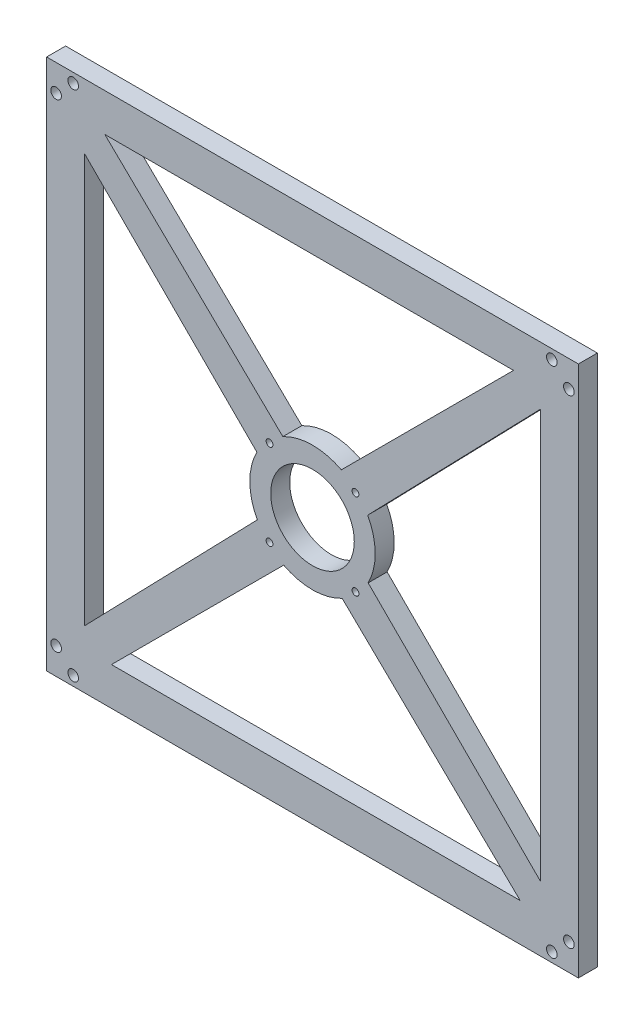
ISO-10303-21;
HEADER;
FILE_DESCRIPTION(('STEP AP214'),'2;1');
FILE_NAME('part.step','',(''),(''),'','','');
FILE_SCHEMA(('AUTOMOTIVE_DESIGN { 1 0 10303 214 1 1 1 1 }'));
ENDSEC;
DATA;
#1=APPLICATION_CONTEXT('core data for automotive mechanical design processes');
#2=APPLICATION_PROTOCOL_DEFINITION('international standard','automotive_design',2000,#1);
#3=PRODUCT_CONTEXT('',#1,'mechanical');
#4=PRODUCT('Part','Part','',(#3));
#5=PRODUCT_RELATED_PRODUCT_CATEGORY('part','',(#4));
#6=PRODUCT_DEFINITION_FORMATION('','',#4);
#7=PRODUCT_DEFINITION_CONTEXT('part definition',#1,'design');
#8=PRODUCT_DEFINITION('design','',#6,#7);
#9=PRODUCT_DEFINITION_SHAPE('','',#8);
#10=(LENGTH_UNIT() NAMED_UNIT(*) SI_UNIT(.MILLI.,.METRE.));
#11=(NAMED_UNIT(*) PLANE_ANGLE_UNIT() SI_UNIT($,.RADIAN.));
#12=(NAMED_UNIT(*) SI_UNIT($,.STERADIAN.) SOLID_ANGLE_UNIT());
#13=UNCERTAINTY_MEASURE_WITH_UNIT(LENGTH_MEASURE(1.E-05),#10,'distance_accuracy_value','');
#14=(GEOMETRIC_REPRESENTATION_CONTEXT(3) GLOBAL_UNCERTAINTY_ASSIGNED_CONTEXT((#13)) GLOBAL_UNIT_ASSIGNED_CONTEXT((#10,
#11,#12)) REPRESENTATION_CONTEXT('',''));
#15=CARTESIAN_POINT('',(0.,0.,0.));
#16=DIRECTION('',(0.,0.,1.));
#17=DIRECTION('',(1.,0.,0.));
#18=AXIS2_PLACEMENT_3D('',#15,#16,#17);
#19=CARTESIAN_POINT('',(0.,0.,0.));
#20=DIRECTION('',(0.,0.,1.));
#21=DIRECTION('',(1.,0.,0.));
#22=AXIS2_PLACEMENT_3D('',#19,#20,#21);
#23=PLANE('',#22);
#24=CARTESIAN_POINT('',(67.5000000000007,62.9999999999993,0.));
#25=DIRECTION('',(0.,0.,1.));
#26=DIRECTION('',(1.,0.,0.));
#27=AXIS2_PLACEMENT_3D('',#24,#25,#26);
#28=CIRCLE('',#27,1.39999999999998);
#29=CARTESIAN_POINT('',(68.9000000000007,62.9999999999993,0.));
#30=VERTEX_POINT('',#29);
#31=EDGE_CURVE('E552',#30,#30,#28,.T.);
#32=ORIENTED_EDGE('',*,*,#31,.T.);
#33=EDGE_LOOP('',(#32));
#34=FACE_BOUND('',#33,.T.);
#35=CARTESIAN_POINT('',(-63.,67.5,0.));
#36=DIRECTION('',(0.,0.,1.));
#37=DIRECTION('',(1.,0.,0.));
#38=AXIS2_PLACEMENT_3D('',#35,#36,#37);
#39=CIRCLE('',#38,1.39999999999999);
#40=CARTESIAN_POINT('',(-61.6,67.5,0.));
#41=VERTEX_POINT('',#40);
#42=EDGE_CURVE('E544',#41,#41,#39,.T.);
#43=ORIENTED_EDGE('',*,*,#42,.T.);
#44=EDGE_LOOP('',(#43));
#45=FACE_BOUND('',#44,.T.);
#46=CARTESIAN_POINT('',(-67.5000000000002,-62.9999999999998,0.));
#47=DIRECTION('',(0.,0.,1.));
#48=DIRECTION('',(1.,0.,0.));
#49=AXIS2_PLACEMENT_3D('',#46,#47,#48);
#50=CIRCLE('',#49,1.39999999999998);
#51=CARTESIAN_POINT('',(-66.1000000000002,-62.9999999999998,0.));
#52=VERTEX_POINT('',#51);
#53=EDGE_CURVE('E536',#52,#52,#50,.T.);
#54=ORIENTED_EDGE('',*,*,#53,.T.);
#55=EDGE_LOOP('',(#54));
#56=FACE_BOUND('',#55,.T.);
#57=CARTESIAN_POINT('',(63.0000000000007,67.4999999999993,0.));
#58=DIRECTION('',(0.,0.,-1.));
#59=DIRECTION('',(-1.,0.,0.));
#60=AXIS2_PLACEMENT_3D('',#57,#58,#59);
#61=CIRCLE('',#60,1.39999999999998);
#62=CARTESIAN_POINT('',(61.6000000000007,67.4999999999993,0.));
#63=VERTEX_POINT('',#62);
#64=EDGE_CURVE('E532',#63,#63,#61,.T.);
#65=ORIENTED_EDGE('',*,*,#64,.F.);
#66=EDGE_LOOP('',(#65));
#67=FACE_BOUND('',#66,.T.);
#68=CARTESIAN_POINT('',(-67.5,63.,0.));
#69=DIRECTION('',(0.,0.,-1.));
#70=DIRECTION('',(-1.,0.,0.));
#71=AXIS2_PLACEMENT_3D('',#68,#69,#70);
#72=CIRCLE('',#71,1.39999999999998);
#73=CARTESIAN_POINT('',(-68.9,63.,0.));
#74=VERTEX_POINT('',#73);
#75=EDGE_CURVE('E522',#74,#74,#72,.T.);
#76=ORIENTED_EDGE('',*,*,#75,.F.);
#77=EDGE_LOOP('',(#76));
#78=FACE_BOUND('',#77,.T.);
#79=CARTESIAN_POINT('',(63.,-67.5,0.));
#80=DIRECTION('',(0.,0.,1.));
#81=DIRECTION('',(1.,0.,0.));
#82=AXIS2_PLACEMENT_3D('',#79,#80,#81);
#83=CIRCLE('',#82,1.39999999999998);
#84=CARTESIAN_POINT('',(64.4,-67.5,0.));
#85=VERTEX_POINT('',#84);
#86=EDGE_CURVE('E42',#85,#85,#83,.T.);
#87=ORIENTED_EDGE('',*,*,#86,.T.);
#88=EDGE_LOOP('',(#87));
#89=FACE_BOUND('',#88,.T.);
#90=CARTESIAN_POINT('',(67.5,-63.,0.));
#91=DIRECTION('',(0.,0.,-1.));
#92=DIRECTION('',(-1.,0.,0.));
#93=AXIS2_PLACEMENT_3D('',#90,#91,#92);
#94=CIRCLE('',#93,1.39999999999998);
#95=CARTESIAN_POINT('',(66.1,-63.,0.));
#96=VERTEX_POINT('',#95);
#97=EDGE_CURVE('E407',#96,#96,#94,.T.);
#98=ORIENTED_EDGE('',*,*,#97,.F.);
#99=EDGE_LOOP('',(#98));
#100=FACE_BOUND('',#99,.T.);
#101=CARTESIAN_POINT('',(-11.3137084989846,-11.3137084989849,0.));
#102=DIRECTION('',(0.,0.,1.));
#103=DIRECTION('',(1.,0.,0.));
#104=AXIS2_PLACEMENT_3D('',#101,#102,#103);
#105=CIRCLE('',#104,0.899999999999999);
#106=CARTESIAN_POINT('',(-10.4137084989846,-11.3137084989849,0.));
#107=VERTEX_POINT('',#106);
#108=EDGE_CURVE('E413',#107,#107,#105,.T.);
#109=ORIENTED_EDGE('',*,*,#108,.T.);
#110=EDGE_LOOP('',(#109));
#111=FACE_BOUND('',#110,.T.);
#112=CARTESIAN_POINT('',(-11.3137084989848,11.3137084989848,0.));
#113=DIRECTION('',(0.,0.,1.));
#114=DIRECTION('',(1.,0.,0.));
#115=AXIS2_PLACEMENT_3D('',#112,#113,#114);
#116=CIRCLE('',#115,0.899999999999999);
#117=CARTESIAN_POINT('',(-10.4137084989848,11.3137084989848,0.));
#118=VERTEX_POINT('',#117);
#119=EDGE_CURVE('E432',#118,#118,#116,.T.);
#120=ORIENTED_EDGE('',*,*,#119,.T.);
#121=EDGE_LOOP('',(#120));
#122=FACE_BOUND('',#121,.T.);
#123=CARTESIAN_POINT('',(11.3137084989847,11.3137084989848,0.));
#124=DIRECTION('',(0.,0.,1.));
#125=DIRECTION('',(1.,0.,0.));
#126=AXIS2_PLACEMENT_3D('',#123,#124,#125);
#127=CIRCLE('',#126,0.899999999999999);
#128=CARTESIAN_POINT('',(12.2137084989847,11.3137084989848,0.));
#129=VERTEX_POINT('',#128);
#130=EDGE_CURVE('E440',#129,#129,#127,.T.);
#131=ORIENTED_EDGE('',*,*,#130,.T.);
#132=EDGE_LOOP('',(#131));
#133=FACE_BOUND('',#132,.T.);
#134=CARTESIAN_POINT('',(11.3137084989848,-11.3137084989848,0.));
#135=DIRECTION('',(0.,0.,1.));
#136=DIRECTION('',(1.,0.,0.));
#137=AXIS2_PLACEMENT_3D('',#134,#135,#136);
#138=CIRCLE('',#137,0.899999999999999);
#139=CARTESIAN_POINT('',(12.2137084989848,-11.3137084989848,0.));
#140=VERTEX_POINT('',#139);
#141=EDGE_CURVE('E398',#140,#140,#138,.T.);
#142=ORIENTED_EDGE('',*,*,#141,.T.);
#143=EDGE_LOOP('',(#142));
#144=FACE_BOUND('',#143,.T.);
#145=CARTESIAN_POINT('',(0.,0.,0.));
#146=DIRECTION('',(0.,0.,1.));
#147=DIRECTION('',(1.,0.,0.));
#148=AXIS2_PLACEMENT_3D('',#145,#146,#147);
#149=CIRCLE('',#148,11.);
#150=CARTESIAN_POINT('',(11.,0.,0.));
#151=VERTEX_POINT('',#150);
#152=EDGE_CURVE('E208',#151,#151,#149,.F.);
#153=ORIENTED_EDGE('',*,*,#152,.F.);
#154=EDGE_LOOP('',(#153));
#155=FACE_BOUND('',#154,.T.);
#156=DIRECTION('',(-0.707106781186548,-0.707106781186547,0.));
#157=VECTOR('',#156,1.);
#158=CARTESIAN_POINT('',(-7.5831440730358,-14.6542118849013,0.));
#159=LINE('',#158,#157);
#160=CARTESIAN_POINT('',(-7.5831440730358,-14.6542118849013,0.));
#161=VERTEX_POINT('',#160);
#162=CARTESIAN_POINT('',(-52.9289321881345,-60.,0.));
#163=VERTEX_POINT('',#162);
#164=EDGE_CURVE('E244',#161,#163,#159,.T.);
#165=ORIENTED_EDGE('',*,*,#164,.T.);
#166=DIRECTION('',(1.,0.,0.));
#167=VECTOR('',#166,1.);
#168=CARTESIAN_POINT('',(54.68839472675,-60.,0.));
#169=LINE('',#168,#167);
#170=CARTESIAN_POINT('',(54.68839472675,-60.,0.));
#171=VERTEX_POINT('',#170);
#172=EDGE_CURVE('E231',#163,#171,#169,.T.);
#173=ORIENTED_EDGE('',*,*,#172,.T.);
#174=DIRECTION('',(-0.717870206431166,0.696176965087524,0.));
#175=VECTOR('',#174,1.);
#176=CARTESIAN_POINT('',(7.80758307049877,-14.5358744696444,0.));
#177=LINE('',#176,#175);
#178=CARTESIAN_POINT('',(7.80758307049877,-14.5358744696444,0.));
#179=VERTEX_POINT('',#178);
#180=EDGE_CURVE('E235',#171,#179,#177,.T.);
#181=ORIENTED_EDGE('',*,*,#180,.T.);
#182=CARTESIAN_POINT('',(0.,0.,0.));
#183=DIRECTION('',(0.,0.,-1.));
#184=DIRECTION('',(1.,0.,0.));
#185=AXIS2_PLACEMENT_3D('',#182,#183,#184);
#186=CIRCLE('',#185,16.5);
#187=EDGE_CURVE('E240',#179,#161,#186,.T.);
#188=ORIENTED_EDGE('',*,*,#187,.T.);
#189=EDGE_LOOP('',(#165,#173,#181,#188));
#190=FACE_BOUND('',#189,.T.);
#191=DIRECTION('',(-0.70710678118654,0.707106781186555,0.));
#192=VECTOR('',#191,1.);
#193=CARTESIAN_POINT('',(-14.6542118849012,7.58314407303596,0.));
#194=LINE('',#193,#192);
#195=CARTESIAN_POINT('',(-14.6542118849012,7.58314407303596,0.));
#196=VERTEX_POINT('',#195);
#197=CARTESIAN_POINT('',(-59.9999999999995,52.9289321881352,0.));
#198=VERTEX_POINT('',#197);
#199=EDGE_CURVE('E187',#196,#198,#194,.T.);
#200=ORIENTED_EDGE('',*,*,#199,.T.);
#201=DIRECTION('',(0.,-1.,0.));
#202=VECTOR('',#201,1.);
#203=CARTESIAN_POINT('',(-60.0000000000006,-54.6883947267494,0.));
#204=LINE('',#203,#202);
#205=CARTESIAN_POINT('',(-60.0000000000006,-54.6883947267494,0.));
#206=VERTEX_POINT('',#205);
#207=EDGE_CURVE('E180',#198,#206,#204,.T.);
#208=ORIENTED_EDGE('',*,*,#207,.T.);
#209=DIRECTION('',(0.696176965087531,0.717870206431159,0.));
#210=VECTOR('',#209,1.);
#211=CARTESIAN_POINT('',(-14.5358744696445,-7.80758307049861,0.));
#212=LINE('',#211,#210);
#213=CARTESIAN_POINT('',(-14.5358744696445,-7.80758307049862,0.));
#214=VERTEX_POINT('',#213);
#215=EDGE_CURVE('E191',#206,#214,#212,.T.);
#216=ORIENTED_EDGE('',*,*,#215,.T.);
#217=CARTESIAN_POINT('',(0.,0.,0.));
#218=DIRECTION('',(0.,0.,-1.));
#219=DIRECTION('',(0.,-1.,0.));
#220=AXIS2_PLACEMENT_3D('',#217,#218,#219);
#221=CIRCLE('',#220,16.5);
#222=EDGE_CURVE('E196',#214,#196,#221,.T.);
#223=ORIENTED_EDGE('',*,*,#222,.T.);
#224=EDGE_LOOP('',(#200,#208,#216,#223));
#225=FACE_BOUND('',#224,.T.);
#226=DIRECTION('',(0.707106781186545,-0.70710678118655,0.));
#227=VECTOR('',#226,1.);
#228=CARTESIAN_POINT('',(14.6542118849013,-7.58314407303586,0.));
#229=LINE('',#228,#227);
#230=CARTESIAN_POINT('',(14.6542118849013,-7.58314407303586,0.));
#231=VERTEX_POINT('',#230);
#232=CARTESIAN_POINT('',(59.9999999999998,-52.9289321881347,0.));
#233=VERTEX_POINT('',#232);
#234=EDGE_CURVE('E287',#231,#233,#229,.T.);
#235=ORIENTED_EDGE('',*,*,#234,.T.);
#236=DIRECTION('',(0.,1.,0.));
#237=VECTOR('',#236,1.);
#238=CARTESIAN_POINT('',(60.0000000000002,54.6883947267498,0.));
#239=LINE('',#238,#237);
#240=CARTESIAN_POINT('',(60.0000000000002,54.6883947267498,0.));
#241=VERTEX_POINT('',#240);
#242=EDGE_CURVE('E274',#233,#241,#239,.T.);
#243=ORIENTED_EDGE('',*,*,#242,.T.);
#244=DIRECTION('',(-0.696176965087526,-0.717870206431164,0.));
#245=VECTOR('',#244,1.);
#246=CARTESIAN_POINT('',(14.5358744696445,7.80758307049872,0.));
#247=LINE('',#246,#245);
#248=CARTESIAN_POINT('',(14.5358744696445,7.80758307049872,0.));
#249=VERTEX_POINT('',#248);
#250=EDGE_CURVE('E278',#241,#249,#247,.T.);
#251=ORIENTED_EDGE('',*,*,#250,.T.);
#252=CARTESIAN_POINT('',(0.,0.,0.));
#253=DIRECTION('',(0.,0.,-1.));
#254=DIRECTION('',(0.,1.,0.));
#255=AXIS2_PLACEMENT_3D('',#252,#253,#254);
#256=CIRCLE('',#255,16.5);
#257=EDGE_CURVE('E283',#249,#231,#256,.T.);
#258=ORIENTED_EDGE('',*,*,#257,.T.);
#259=EDGE_LOOP('',(#235,#243,#251,#258));
#260=FACE_BOUND('',#259,.T.);
#261=DIRECTION('',(0.707106781186548,0.707106781186547,0.));
#262=VECTOR('',#261,1.);
#263=CARTESIAN_POINT('',(7.5831440730358,14.6542118849013,0.));
#264=LINE('',#263,#262);
#265=CARTESIAN_POINT('',(7.5831440730358,14.6542118849013,0.));
#266=VERTEX_POINT('',#265);
#267=CARTESIAN_POINT('',(52.9289321881345,60.,0.));
#268=VERTEX_POINT('',#267);
#269=EDGE_CURVE('E331',#266,#268,#264,.T.);
#270=ORIENTED_EDGE('',*,*,#269,.T.);
#271=DIRECTION('',(-1.,0.,0.));
#272=VECTOR('',#271,1.);
#273=CARTESIAN_POINT('',(-54.68839472675,60.,0.));
#274=LINE('',#273,#272);
#275=CARTESIAN_POINT('',(-54.68839472675,60.,0.));
#276=VERTEX_POINT('',#275);
#277=EDGE_CURVE('E318',#268,#276,#274,.T.);
#278=ORIENTED_EDGE('',*,*,#277,.T.);
#279=DIRECTION('',(0.717870206431166,-0.696176965087524,0.));
#280=VECTOR('',#279,1.);
#281=CARTESIAN_POINT('',(-7.80758307049877,14.5358744696444,0.));
#282=LINE('',#281,#280);
#283=CARTESIAN_POINT('',(-7.80758307049877,14.5358744696444,0.));
#284=VERTEX_POINT('',#283);
#285=EDGE_CURVE('E322',#276,#284,#282,.T.);
#286=ORIENTED_EDGE('',*,*,#285,.T.);
#287=CARTESIAN_POINT('',(0.,0.,0.));
#288=DIRECTION('',(0.,0.,-1.));
#289=DIRECTION('',(-1.,0.,0.));
#290=AXIS2_PLACEMENT_3D('',#287,#288,#289);
#291=CIRCLE('',#290,16.5);
#292=EDGE_CURVE('E327',#284,#266,#291,.T.);
#293=ORIENTED_EDGE('',*,*,#292,.T.);
#294=EDGE_LOOP('',(#270,#278,#286,#293));
#295=FACE_BOUND('',#294,.T.);
#296=DIRECTION('',(0.,1.,0.));
#297=VECTOR('',#296,1.);
#298=CARTESIAN_POINT('',(70.,70.,0.));
#299=LINE('',#298,#297);
#300=CARTESIAN_POINT('',(70.,-70.,0.));
#301=VERTEX_POINT('',#300);
#302=CARTESIAN_POINT('',(70.,70.,0.));
#303=VERTEX_POINT('',#302);
#304=EDGE_CURVE('E352',#301,#303,#299,.T.);
#305=ORIENTED_EDGE('',*,*,#304,.F.);
#306=DIRECTION('',(1.,0.,0.));
#307=VECTOR('',#306,1.);
#308=CARTESIAN_POINT('',(-70.,-70.,0.));
#309=LINE('',#308,#307);
#310=CARTESIAN_POINT('',(-70.,-70.,0.));
#311=VERTEX_POINT('',#310);
#312=EDGE_CURVE('E367',#311,#301,#309,.T.);
#313=ORIENTED_EDGE('',*,*,#312,.F.);
#314=DIRECTION('',(0.,-1.,0.));
#315=VECTOR('',#314,1.);
#316=CARTESIAN_POINT('',(-70.,70.,0.));
#317=LINE('',#316,#315);
#318=CARTESIAN_POINT('',(-70.,70.,0.));
#319=VERTEX_POINT('',#318);
#320=EDGE_CURVE('E383',#319,#311,#317,.T.);
#321=ORIENTED_EDGE('',*,*,#320,.F.);
#322=DIRECTION('',(-1.,0.,0.));
#323=VECTOR('',#322,1.);
#324=CARTESIAN_POINT('',(-70.,70.,0.));
#325=LINE('',#324,#323);
#326=EDGE_CURVE('E380',#303,#319,#325,.T.);
#327=ORIENTED_EDGE('',*,*,#326,.F.);
#328=EDGE_LOOP('',(#305,#313,#321,#327));
#329=FACE_BOUND('',#328,.T.);
#330=CARTESIAN_POINT('',(-63.0000000000002,-67.4999999999998,0.));
#331=DIRECTION('',(0.,0.,-1.));
#332=DIRECTION('',(-1.,0.,0.));
#333=AXIS2_PLACEMENT_3D('',#330,#331,#332);
#334=CIRCLE('',#333,1.39999999999999);
#335=CARTESIAN_POINT('',(-64.4000000000002,-67.4999999999998,0.));
#336=VERTEX_POINT('',#335);
#337=EDGE_CURVE('E512',#336,#336,#334,.T.);
#338=ORIENTED_EDGE('',*,*,#337,.F.);
#339=EDGE_LOOP('',(#338));
#340=FACE_BOUND('',#339,.T.);
#341=ADVANCED_FACE('F38',(#34,#45,#56,#67,#78,#89,#100,#111,#122,#133,#144,#155,#190,#225,#260,
#295,#329,#340),#23,.F.);
#342=CARTESIAN_POINT('',(70.,70.,5.));
#343=DIRECTION('',(-1.,0.,0.));
#344=DIRECTION('',(0.,0.,1.));
#345=AXIS2_PLACEMENT_3D('',#342,#343,#344);
#346=PLANE('',#345);
#347=ORIENTED_EDGE('',*,*,#304,.T.);
#348=DIRECTION('',(0.,0.,-1.));
#349=VECTOR('',#348,1.);
#350=CARTESIAN_POINT('',(70.,70.,5.));
#351=LINE('',#350,#349);
#352=CARTESIAN_POINT('',(70.,70.,5.));
#353=VERTEX_POINT('',#352);
#354=EDGE_CURVE('E11',#353,#303,#351,.T.);
#355=ORIENTED_EDGE('',*,*,#354,.F.);
#356=DIRECTION('',(0.,1.,0.));
#357=VECTOR('',#356,1.);
#358=CARTESIAN_POINT('',(70.,70.,5.));
#359=LINE('',#358,#357);
#360=CARTESIAN_POINT('',(70.,-70.,5.));
#361=VERTEX_POINT('',#360);
#362=EDGE_CURVE('E362',#361,#353,#359,.T.);
#363=ORIENTED_EDGE('',*,*,#362,.F.);
#364=DIRECTION('',(0.,0.,-1.));
#365=VECTOR('',#364,1.);
#366=CARTESIAN_POINT('',(70.,-70.,5.));
#367=LINE('',#366,#365);
#368=EDGE_CURVE('E376',#361,#301,#367,.T.);
#369=ORIENTED_EDGE('',*,*,#368,.T.);
#370=EDGE_LOOP('',(#347,#355,#363,#369));
#371=FACE_BOUND('',#370,.T.);
#372=ADVANCED_FACE('F40',(#371),#346,.F.);
#373=CARTESIAN_POINT('',(-70.,70.,5.));
#374=DIRECTION('',(0.,-1.,0.));
#375=DIRECTION('',(0.,0.,-1.));
#376=AXIS2_PLACEMENT_3D('',#373,#374,#375);
#377=PLANE('',#376);
#378=ORIENTED_EDGE('',*,*,#326,.T.);
#379=DIRECTION('',(0.,0.,-1.));
#380=VECTOR('',#379,1.);
#381=CARTESIAN_POINT('',(-70.,70.,5.));
#382=LINE('',#381,#380);
#383=CARTESIAN_POINT('',(-70.,70.,5.));
#384=VERTEX_POINT('',#383);
#385=EDGE_CURVE('E48',#384,#319,#382,.T.);
#386=ORIENTED_EDGE('',*,*,#385,.F.);
#387=DIRECTION('',(-1.,0.,0.));
#388=VECTOR('',#387,1.);
#389=CARTESIAN_POINT('',(-70.,70.,5.));
#390=LINE('',#389,#388);
#391=EDGE_CURVE('E366',#353,#384,#390,.T.);
#392=ORIENTED_EDGE('',*,*,#391,.F.);
#393=ORIENTED_EDGE('',*,*,#354,.T.);
#394=EDGE_LOOP('',(#378,#386,#392,#393));
#395=FACE_BOUND('',#394,.T.);
#396=ADVANCED_FACE('F500',(#395),#377,.F.);
#397=CARTESIAN_POINT('',(-70.,70.,5.));
#398=DIRECTION('',(1.,0.,0.));
#399=DIRECTION('',(0.,0.,-1.));
#400=AXIS2_PLACEMENT_3D('',#397,#398,#399);
#401=PLANE('',#400);
#402=ORIENTED_EDGE('',*,*,#320,.T.);
#403=DIRECTION('',(0.,0.,-1.));
#404=VECTOR('',#403,1.);
#405=CARTESIAN_POINT('',(-70.,-70.,5.));
#406=LINE('',#405,#404);
#407=CARTESIAN_POINT('',(-70.,-70.,5.));
#408=VERTEX_POINT('',#407);
#409=EDGE_CURVE('E391',#408,#311,#406,.T.);
#410=ORIENTED_EDGE('',*,*,#409,.F.);
#411=DIRECTION('',(0.,-1.,0.));
#412=VECTOR('',#411,1.);
#413=CARTESIAN_POINT('',(-70.,70.,5.));
#414=LINE('',#413,#412);
#415=EDGE_CURVE('E370',#384,#408,#414,.T.);
#416=ORIENTED_EDGE('',*,*,#415,.F.);
#417=ORIENTED_EDGE('',*,*,#385,.T.);
#418=EDGE_LOOP('',(#402,#410,#416,#417));
#419=FACE_BOUND('',#418,.T.);
#420=ADVANCED_FACE('F505',(#419),#401,.F.);
#421=CARTESIAN_POINT('',(-70.,-70.,5.));
#422=DIRECTION('',(0.,1.,0.));
#423=DIRECTION('',(0.,0.,1.));
#424=AXIS2_PLACEMENT_3D('',#421,#422,#423);
#425=PLANE('',#424);
#426=ORIENTED_EDGE('',*,*,#312,.T.);
#427=ORIENTED_EDGE('',*,*,#368,.F.);
#428=DIRECTION('',(1.,0.,0.));
#429=VECTOR('',#428,1.);
#430=CARTESIAN_POINT('',(-70.,-70.,5.));
#431=LINE('',#430,#429);
#432=EDGE_CURVE('E373',#408,#361,#431,.T.);
#433=ORIENTED_EDGE('',*,*,#432,.F.);
#434=ORIENTED_EDGE('',*,*,#409,.T.);
#435=EDGE_LOOP('',(#426,#427,#433,#434));
#436=FACE_BOUND('',#435,.T.);
#437=ADVANCED_FACE('F479',(#436),#425,.F.);
#438=CARTESIAN_POINT('',(0.,0.,5.));
#439=DIRECTION('',(0.,0.,1.));
#440=DIRECTION('',(1.,0.,0.));
#441=AXIS2_PLACEMENT_3D('',#438,#439,#440);
#442=PLANE('',#441);
#443=CARTESIAN_POINT('',(67.5000000000007,62.9999999999993,5.));
#444=DIRECTION('',(0.,0.,1.));
#445=DIRECTION('',(1.,0.,0.));
#446=AXIS2_PLACEMENT_3D('',#443,#444,#445);
#447=CIRCLE('',#446,1.39999999999998);
#448=CARTESIAN_POINT('',(68.9000000000007,62.9999999999993,5.));
#449=VERTEX_POINT('',#448);
#450=EDGE_CURVE('E556',#449,#449,#447,.T.);
#451=ORIENTED_EDGE('',*,*,#450,.F.);
#452=EDGE_LOOP('',(#451));
#453=FACE_BOUND('',#452,.T.);
#454=CARTESIAN_POINT('',(-63.,67.5,5.));
#455=DIRECTION('',(0.,0.,1.));
#456=DIRECTION('',(1.,0.,0.));
#457=AXIS2_PLACEMENT_3D('',#454,#455,#456);
#458=CIRCLE('',#457,1.39999999999999);
#459=CARTESIAN_POINT('',(-61.6,67.5,5.));
#460=VERTEX_POINT('',#459);
#461=EDGE_CURVE('E548',#460,#460,#458,.T.);
#462=ORIENTED_EDGE('',*,*,#461,.F.);
#463=EDGE_LOOP('',(#462));
#464=FACE_BOUND('',#463,.T.);
#465=CARTESIAN_POINT('',(-67.5000000000002,-62.9999999999998,5.));
#466=DIRECTION('',(0.,0.,1.));
#467=DIRECTION('',(1.,0.,0.));
#468=AXIS2_PLACEMENT_3D('',#465,#466,#467);
#469=CIRCLE('',#468,1.39999999999998);
#470=CARTESIAN_POINT('',(-66.1000000000002,-62.9999999999998,5.));
#471=VERTEX_POINT('',#470);
#472=EDGE_CURVE('E540',#471,#471,#469,.T.);
#473=ORIENTED_EDGE('',*,*,#472,.F.);
#474=EDGE_LOOP('',(#473));
#475=FACE_BOUND('',#474,.T.);
#476=CARTESIAN_POINT('',(63.0000000000007,67.4999999999993,5.));
#477=DIRECTION('',(0.,0.,1.));
#478=DIRECTION('',(1.,0.,0.));
#479=AXIS2_PLACEMENT_3D('',#476,#477,#478);
#480=CIRCLE('',#479,1.39999999999998);
#481=CARTESIAN_POINT('',(64.4000000000007,67.4999999999993,5.));
#482=VERTEX_POINT('',#481);
#483=EDGE_CURVE('E528',#482,#482,#480,.T.);
#484=ORIENTED_EDGE('',*,*,#483,.F.);
#485=EDGE_LOOP('',(#484));
#486=FACE_BOUND('',#485,.T.);
#487=CARTESIAN_POINT('',(-67.5,63.,5.));
#488=DIRECTION('',(0.,0.,1.));
#489=DIRECTION('',(1.,0.,0.));
#490=AXIS2_PLACEMENT_3D('',#487,#488,#489);
#491=CIRCLE('',#490,1.39999999999998);
#492=CARTESIAN_POINT('',(-66.1,63.,5.));
#493=VERTEX_POINT('',#492);
#494=EDGE_CURVE('E516',#493,#493,#491,.T.);
#495=ORIENTED_EDGE('',*,*,#494,.F.);
#496=EDGE_LOOP('',(#495));
#497=FACE_BOUND('',#496,.T.);
#498=CARTESIAN_POINT('',(-63.0000000000002,-67.4999999999998,5.));
#499=DIRECTION('',(0.,0.,1.));
#500=DIRECTION('',(1.,0.,0.));
#501=AXIS2_PLACEMENT_3D('',#498,#499,#500);
#502=CIRCLE('',#501,1.39999999999999);
#503=CARTESIAN_POINT('',(-61.6000000000003,-67.4999999999998,5.));
#504=VERTEX_POINT('',#503);
#505=EDGE_CURVE('E515',#504,#504,#502,.T.);
#506=ORIENTED_EDGE('',*,*,#505,.F.);
#507=EDGE_LOOP('',(#506));
#508=FACE_BOUND('',#507,.T.);
#509=CARTESIAN_POINT('',(63.,-67.5,5.));
#510=DIRECTION('',(0.,0.,1.));
#511=DIRECTION('',(1.,0.,0.));
#512=AXIS2_PLACEMENT_3D('',#509,#510,#511);
#513=CIRCLE('',#512,1.39999999999998);
#514=CARTESIAN_POINT('',(64.4,-67.5,5.));
#515=VERTEX_POINT('',#514);
#516=EDGE_CURVE('E421',#515,#515,#513,.T.);
#517=ORIENTED_EDGE('',*,*,#516,.F.);
#518=EDGE_LOOP('',(#517));
#519=FACE_BOUND('',#518,.T.);
#520=CARTESIAN_POINT('',(67.5,-63.,5.));
#521=DIRECTION('',(0.,0.,1.));
#522=DIRECTION('',(1.,0.,0.));
#523=AXIS2_PLACEMENT_3D('',#520,#521,#522);
#524=CIRCLE('',#523,1.39999999999998);
#525=CARTESIAN_POINT('',(68.9,-63.,5.));
#526=VERTEX_POINT('',#525);
#527=EDGE_CURVE('E403',#526,#526,#524,.T.);
#528=ORIENTED_EDGE('',*,*,#527,.F.);
#529=EDGE_LOOP('',(#528));
#530=FACE_BOUND('',#529,.T.);
#531=CARTESIAN_POINT('',(-11.3137084989846,-11.3137084989849,5.));
#532=DIRECTION('',(0.,0.,1.));
#533=DIRECTION('',(1.,0.,0.));
#534=AXIS2_PLACEMENT_3D('',#531,#532,#533);
#535=CIRCLE('',#534,0.9);
#536=CARTESIAN_POINT('',(-10.4137084989846,-11.3137084989849,5.));
#537=VERTEX_POINT('',#536);
#538=EDGE_CURVE('E406',#537,#537,#535,.T.);
#539=ORIENTED_EDGE('',*,*,#538,.F.);
#540=EDGE_LOOP('',(#539));
#541=FACE_BOUND('',#540,.T.);
#542=CARTESIAN_POINT('',(-11.3137084989848,11.3137084989848,5.));
#543=DIRECTION('',(0.,0.,1.));
#544=DIRECTION('',(1.,0.,0.));
#545=AXIS2_PLACEMENT_3D('',#542,#543,#544);
#546=CIRCLE('',#545,0.9);
#547=CARTESIAN_POINT('',(-10.4137084989848,11.3137084989848,5.));
#548=VERTEX_POINT('',#547);
#549=EDGE_CURVE('E428',#548,#548,#546,.T.);
#550=ORIENTED_EDGE('',*,*,#549,.F.);
#551=EDGE_LOOP('',(#550));
#552=FACE_BOUND('',#551,.T.);
#553=CARTESIAN_POINT('',(11.3137084989847,11.3137084989848,5.));
#554=DIRECTION('',(0.,0.,1.));
#555=DIRECTION('',(1.,0.,0.));
#556=AXIS2_PLACEMENT_3D('',#553,#554,#555);
#557=CIRCLE('',#556,0.9);
#558=CARTESIAN_POINT('',(12.2137084989847,11.3137084989848,5.));
#559=VERTEX_POINT('',#558);
#560=EDGE_CURVE('E436',#559,#559,#557,.T.);
#561=ORIENTED_EDGE('',*,*,#560,.F.);
#562=EDGE_LOOP('',(#561));
#563=FACE_BOUND('',#562,.T.);
#564=CARTESIAN_POINT('',(11.3137084989848,-11.3137084989848,5.));
#565=DIRECTION('',(0.,0.,1.));
#566=DIRECTION('',(1.,0.,0.));
#567=AXIS2_PLACEMENT_3D('',#564,#565,#566);
#568=CIRCLE('',#567,0.9);
#569=CARTESIAN_POINT('',(12.2137084989848,-11.3137084989848,5.));
#570=VERTEX_POINT('',#569);
#571=EDGE_CURVE('E402',#570,#570,#568,.T.);
#572=ORIENTED_EDGE('',*,*,#571,.F.);
#573=EDGE_LOOP('',(#572));
#574=FACE_BOUND('',#573,.T.);
#575=CARTESIAN_POINT('',(0.,0.,5.));
#576=DIRECTION('',(0.,0.,1.));
#577=DIRECTION('',(1.,0.,0.));
#578=AXIS2_PLACEMENT_3D('',#575,#576,#577);
#579=CIRCLE('',#578,11.);
#580=CARTESIAN_POINT('',(11.,0.,5.));
#581=VERTEX_POINT('',#580);
#582=EDGE_CURVE('E401',#581,#581,#579,.T.);
#583=ORIENTED_EDGE('',*,*,#582,.F.);
#584=EDGE_LOOP('',(#583));
#585=FACE_BOUND('',#584,.T.);
#586=DIRECTION('',(1.,0.,0.));
#587=VECTOR('',#586,1.);
#588=CARTESIAN_POINT('',(54.68839472675,-60.,5.));
#589=LINE('',#588,#587);
#590=CARTESIAN_POINT('',(-52.9289321881345,-60.,5.));
#591=VERTEX_POINT('',#590);
#592=CARTESIAN_POINT('',(54.68839472675,-60.,5.));
#593=VERTEX_POINT('',#592);
#594=EDGE_CURVE('E56',#591,#593,#589,.T.);
#595=ORIENTED_EDGE('',*,*,#594,.F.);
#596=DIRECTION('',(-0.707106781186548,-0.707106781186547,0.));
#597=VECTOR('',#596,1.);
#598=CARTESIAN_POINT('',(-7.5831440730358,-14.6542118849013,5.));
#599=LINE('',#598,#597);
#600=CARTESIAN_POINT('',(-7.5831440730358,-14.6542118849013,5.));
#601=VERTEX_POINT('',#600);
#602=EDGE_CURVE('E236',#601,#591,#599,.T.);
#603=ORIENTED_EDGE('',*,*,#602,.F.);
#604=CARTESIAN_POINT('',(0.,0.,5.));
#605=DIRECTION('',(0.,0.,-1.));
#606=DIRECTION('',(1.,0.,0.));
#607=AXIS2_PLACEMENT_3D('',#604,#605,#606);
#608=CIRCLE('',#607,16.5);
#609=CARTESIAN_POINT('',(7.80758307049877,-14.5358744696444,5.));
#610=VERTEX_POINT('',#609);
#611=EDGE_CURVE('E255',#610,#601,#608,.T.);
#612=ORIENTED_EDGE('',*,*,#611,.F.);
#613=DIRECTION('',(-0.717870206431166,0.696176965087524,0.));
#614=VECTOR('',#613,1.);
#615=CARTESIAN_POINT('',(7.80758307049877,-14.5358744696444,5.));
#616=LINE('',#615,#614);
#617=EDGE_CURVE('E251',#593,#610,#616,.T.);
#618=ORIENTED_EDGE('',*,*,#617,.F.);
#619=EDGE_LOOP('',(#595,#603,#612,#618));
#620=FACE_BOUND('',#619,.T.);
#621=DIRECTION('',(0.,-1.,0.));
#622=VECTOR('',#621,1.);
#623=CARTESIAN_POINT('',(-60.0000000000006,-54.6883947267494,5.));
#624=LINE('',#623,#622);
#625=CARTESIAN_POINT('',(-59.9999999999995,52.9289321881352,5.));
#626=VERTEX_POINT('',#625);
#627=CARTESIAN_POINT('',(-60.0000000000006,-54.6883947267494,5.));
#628=VERTEX_POINT('',#627);
#629=EDGE_CURVE('E64',#626,#628,#624,.T.);
#630=ORIENTED_EDGE('',*,*,#629,.F.);
#631=DIRECTION('',(-0.70710678118654,0.707106781186555,0.));
#632=VECTOR('',#631,1.);
#633=CARTESIAN_POINT('',(-14.6542118849012,7.58314407303596,5.));
#634=LINE('',#633,#632);
#635=CARTESIAN_POINT('',(-14.6542118849012,7.58314407303596,5.));
#636=VERTEX_POINT('',#635);
#637=EDGE_CURVE('E201',#636,#626,#634,.T.);
#638=ORIENTED_EDGE('',*,*,#637,.F.);
#639=CARTESIAN_POINT('',(0.,0.,5.));
#640=DIRECTION('',(0.,0.,-1.));
#641=DIRECTION('',(0.,-1.,0.));
#642=AXIS2_PLACEMENT_3D('',#639,#640,#641);
#643=CIRCLE('',#642,16.5);
#644=CARTESIAN_POINT('',(-14.5358744696445,-7.80758307049861,5.));
#645=VERTEX_POINT('',#644);
#646=EDGE_CURVE('E205',#645,#636,#643,.T.);
#647=ORIENTED_EDGE('',*,*,#646,.F.);
#648=DIRECTION('',(0.696176965087531,0.717870206431159,0.));
#649=VECTOR('',#648,1.);
#650=CARTESIAN_POINT('',(-14.5358744696445,-7.80758307049861,5.));
#651=LINE('',#650,#649);
#652=EDGE_CURVE('E217',#628,#645,#651,.T.);
#653=ORIENTED_EDGE('',*,*,#652,.F.);
#654=EDGE_LOOP('',(#630,#638,#647,#653));
#655=FACE_BOUND('',#654,.T.);
#656=DIRECTION('',(0.,1.,0.));
#657=VECTOR('',#656,1.);
#658=CARTESIAN_POINT('',(60.0000000000002,54.6883947267498,5.));
#659=LINE('',#658,#657);
#660=CARTESIAN_POINT('',(59.9999999999998,-52.9289321881347,5.));
#661=VERTEX_POINT('',#660);
#662=CARTESIAN_POINT('',(60.0000000000002,54.6883947267498,5.));
#663=VERTEX_POINT('',#662);
#664=EDGE_CURVE('E265',#661,#663,#659,.T.);
#665=ORIENTED_EDGE('',*,*,#664,.F.);
#666=DIRECTION('',(0.707106781186545,-0.70710678118655,0.));
#667=VECTOR('',#666,1.);
#668=CARTESIAN_POINT('',(14.6542118849013,-7.58314407303586,5.));
#669=LINE('',#668,#667);
#670=CARTESIAN_POINT('',(14.6542118849013,-7.58314407303586,5.));
#671=VERTEX_POINT('',#670);
#672=EDGE_CURVE('E279',#671,#661,#669,.T.);
#673=ORIENTED_EDGE('',*,*,#672,.F.);
#674=CARTESIAN_POINT('',(0.,0.,5.));
#675=DIRECTION('',(0.,0.,-1.));
#676=DIRECTION('',(0.,1.,0.));
#677=AXIS2_PLACEMENT_3D('',#674,#675,#676);
#678=CIRCLE('',#677,16.5);
#679=CARTESIAN_POINT('',(14.5358744696445,7.80758307049872,5.));
#680=VERTEX_POINT('',#679);
#681=EDGE_CURVE('E298',#680,#671,#678,.T.);
#682=ORIENTED_EDGE('',*,*,#681,.F.);
#683=DIRECTION('',(-0.696176965087526,-0.717870206431164,0.));
#684=VECTOR('',#683,1.);
#685=CARTESIAN_POINT('',(14.5358744696445,7.80758307049872,5.));
#686=LINE('',#685,#684);
#687=EDGE_CURVE('E294',#663,#680,#686,.T.);
#688=ORIENTED_EDGE('',*,*,#687,.F.);
#689=EDGE_LOOP('',(#665,#673,#682,#688));
#690=FACE_BOUND('',#689,.T.);
#691=DIRECTION('',(-1.,0.,0.));
#692=VECTOR('',#691,1.);
#693=CARTESIAN_POINT('',(-54.68839472675,60.,5.));
#694=LINE('',#693,#692);
#695=CARTESIAN_POINT('',(52.9289321881345,60.,5.));
#696=VERTEX_POINT('',#695);
#697=CARTESIAN_POINT('',(-54.68839472675,60.,5.));
#698=VERTEX_POINT('',#697);
#699=EDGE_CURVE('E308',#696,#698,#694,.T.);
#700=ORIENTED_EDGE('',*,*,#699,.F.);
#701=DIRECTION('',(0.707106781186548,0.707106781186547,0.));
#702=VECTOR('',#701,1.);
#703=CARTESIAN_POINT('',(7.5831440730358,14.6542118849013,5.));
#704=LINE('',#703,#702);
#705=CARTESIAN_POINT('',(7.5831440730358,14.6542118849013,5.));
#706=VERTEX_POINT('',#705);
#707=EDGE_CURVE('E323',#706,#696,#704,.T.);
#708=ORIENTED_EDGE('',*,*,#707,.F.);
#709=CARTESIAN_POINT('',(0.,0.,5.));
#710=DIRECTION('',(0.,0.,-1.));
#711=DIRECTION('',(-1.,0.,0.));
#712=AXIS2_PLACEMENT_3D('',#709,#710,#711);
#713=CIRCLE('',#712,16.5);
#714=CARTESIAN_POINT('',(-7.80758307049877,14.5358744696444,5.));
#715=VERTEX_POINT('',#714);
#716=EDGE_CURVE('E342',#715,#706,#713,.T.);
#717=ORIENTED_EDGE('',*,*,#716,.F.);
#718=DIRECTION('',(0.717870206431166,-0.696176965087524,0.));
#719=VECTOR('',#718,1.);
#720=CARTESIAN_POINT('',(-7.80758307049877,14.5358744696444,5.));
#721=LINE('',#720,#719);
#722=EDGE_CURVE('E338',#698,#715,#721,.T.);
#723=ORIENTED_EDGE('',*,*,#722,.F.);
#724=EDGE_LOOP('',(#700,#708,#717,#723));
#725=FACE_BOUND('',#724,.T.);
#726=ORIENTED_EDGE('',*,*,#362,.T.);
#727=ORIENTED_EDGE('',*,*,#391,.T.);
#728=ORIENTED_EDGE('',*,*,#415,.T.);
#729=ORIENTED_EDGE('',*,*,#432,.T.);
#730=EDGE_LOOP('',(#726,#727,#728,#729));
#731=FACE_BOUND('',#730,.T.);
#732=ADVANCED_FACE('F475',(#453,#464,#475,#486,#497,#508,#519,#530,#541,#552,#563,#574,#585,
#620,#655,#690,#725,#731),#442,.T.);
#733=CARTESIAN_POINT('',(-54.68839472675,60.,0.));
#734=DIRECTION('',(0.,1.,0.));
#735=DIRECTION('',(0.,0.,1.));
#736=AXIS2_PLACEMENT_3D('',#733,#734,#735);
#737=PLANE('',#736);
#738=ORIENTED_EDGE('',*,*,#699,.T.);
#739=DIRECTION('',(0.,0.,1.));
#740=VECTOR('',#739,1.);
#741=CARTESIAN_POINT('',(-54.68839472675,60.,0.));
#742=LINE('',#741,#740);
#743=EDGE_CURVE('E335',#276,#698,#742,.T.);
#744=ORIENTED_EDGE('',*,*,#743,.F.);
#745=ORIENTED_EDGE('',*,*,#277,.F.);
#746=DIRECTION('',(0.,0.,1.));
#747=VECTOR('',#746,1.);
#748=CARTESIAN_POINT('',(52.9289321881345,60.,0.));
#749=LINE('',#748,#747);
#750=EDGE_CURVE('E349',#268,#696,#749,.T.);
#751=ORIENTED_EDGE('',*,*,#750,.T.);
#752=EDGE_LOOP('',(#738,#744,#745,#751));
#753=FACE_BOUND('',#752,.T.);
#754=ADVANCED_FACE('F478',(#753),#737,.F.);
#755=CARTESIAN_POINT('',(7.5831440730358,14.6542118849013,0.));
#756=DIRECTION('',(0.707106781186547,-0.707106781186548,0.));
#757=DIRECTION('',(0.707106781186548,0.707106781186547,0.));
#758=AXIS2_PLACEMENT_3D('',#755,#756,#757);
#759=PLANE('',#758);
#760=ORIENTED_EDGE('',*,*,#707,.T.);
#761=ORIENTED_EDGE('',*,*,#750,.F.);
#762=ORIENTED_EDGE('',*,*,#269,.F.);
#763=DIRECTION('',(0.,0.,1.));
#764=VECTOR('',#763,1.);
#765=CARTESIAN_POINT('',(7.5831440730358,14.6542118849013,0.));
#766=LINE('',#765,#764);
#767=EDGE_CURVE('E353',#266,#706,#766,.T.);
#768=ORIENTED_EDGE('',*,*,#767,.T.);
#769=EDGE_LOOP('',(#760,#761,#762,#768));
#770=FACE_BOUND('',#769,.T.);
#771=ADVANCED_FACE('F641',(#770),#759,.F.);
#772=CARTESIAN_POINT('',(0.,0.,0.));
#773=DIRECTION('',(0.,0.,1.));
#774=DIRECTION('',(1.,0.,0.));
#775=AXIS2_PLACEMENT_3D('',#772,#773,#774);
#776=CYLINDRICAL_SURFACE('',#775,16.5);
#777=ORIENTED_EDGE('',*,*,#716,.T.);
#778=ORIENTED_EDGE('',*,*,#767,.F.);
#779=ORIENTED_EDGE('',*,*,#292,.F.);
#780=DIRECTION('',(0.,0.,1.));
#781=VECTOR('',#780,1.);
#782=CARTESIAN_POINT('',(-7.80758307049877,14.5358744696444,0.));
#783=LINE('',#782,#781);
#784=EDGE_CURVE('E356',#284,#715,#783,.T.);
#785=ORIENTED_EDGE('',*,*,#784,.T.);
#786=EDGE_LOOP('',(#777,#778,#779,#785));
#787=FACE_BOUND('',#786,.T.);
#788=ADVANCED_FACE('F644',(#787),#776,.T.);
#789=CARTESIAN_POINT('',(-7.80758307049877,14.5358744696444,0.));
#790=DIRECTION('',(-0.696176965087523,-0.717870206431166,0.));
#791=DIRECTION('',(0.717870206431166,-0.696176965087523,0.));
#792=AXIS2_PLACEMENT_3D('',#789,#790,#791);
#793=PLANE('',#792);
#794=ORIENTED_EDGE('',*,*,#722,.T.);
#795=ORIENTED_EDGE('',*,*,#784,.F.);
#796=ORIENTED_EDGE('',*,*,#285,.F.);
#797=ORIENTED_EDGE('',*,*,#743,.T.);
#798=EDGE_LOOP('',(#794,#795,#796,#797));
#799=FACE_BOUND('',#798,.T.);
#800=ADVANCED_FACE('F639',(#799),#793,.F.);
#801=CARTESIAN_POINT('',(60.0000000000002,54.6883947267498,0.));
#802=DIRECTION('',(1.,0.,0.));
#803=DIRECTION('',(0.,1.,0.));
#804=AXIS2_PLACEMENT_3D('',#801,#802,#803);
#805=PLANE('',#804);
#806=ORIENTED_EDGE('',*,*,#664,.T.);
#807=DIRECTION('',(0.,0.,1.));
#808=VECTOR('',#807,1.);
#809=CARTESIAN_POINT('',(60.0000000000002,54.6883947267498,0.));
#810=LINE('',#809,#808);
#811=EDGE_CURVE('E291',#241,#663,#810,.T.);
#812=ORIENTED_EDGE('',*,*,#811,.F.);
#813=ORIENTED_EDGE('',*,*,#242,.F.);
#814=DIRECTION('',(0.,0.,1.));
#815=VECTOR('',#814,1.);
#816=CARTESIAN_POINT('',(59.9999999999998,-52.9289321881347,0.));
#817=LINE('',#816,#815);
#818=EDGE_CURVE('E305',#233,#661,#817,.T.);
#819=ORIENTED_EDGE('',*,*,#818,.T.);
#820=EDGE_LOOP('',(#806,#812,#813,#819));
#821=FACE_BOUND('',#820,.T.);
#822=ADVANCED_FACE('F629',(#821),#805,.F.);
#823=CARTESIAN_POINT('',(14.6542118849013,-7.58314407303586,0.));
#824=DIRECTION('',(-0.70710678118655,-0.707106781186545,0.));
#825=DIRECTION('',(0.707106781186545,-0.70710678118655,0.));
#826=AXIS2_PLACEMENT_3D('',#823,#824,#825);
#827=PLANE('',#826);
#828=ORIENTED_EDGE('',*,*,#672,.T.);
#829=ORIENTED_EDGE('',*,*,#818,.F.);
#830=ORIENTED_EDGE('',*,*,#234,.F.);
#831=DIRECTION('',(0.,0.,1.));
#832=VECTOR('',#831,1.);
#833=CARTESIAN_POINT('',(14.6542118849013,-7.58314407303586,0.));
#834=LINE('',#833,#832);
#835=EDGE_CURVE('E309',#231,#671,#834,.T.);
#836=ORIENTED_EDGE('',*,*,#835,.T.);
#837=EDGE_LOOP('',(#828,#829,#830,#836));
#838=FACE_BOUND('',#837,.T.);
#839=ADVANCED_FACE('F625',(#838),#827,.F.);
#840=CARTESIAN_POINT('',(0.,0.,0.));
#841=DIRECTION('',(0.,0.,1.));
#842=DIRECTION('',(1.,0.,0.));
#843=AXIS2_PLACEMENT_3D('',#840,#841,#842);
#844=CYLINDRICAL_SURFACE('',#843,16.5);
#845=ORIENTED_EDGE('',*,*,#681,.T.);
#846=ORIENTED_EDGE('',*,*,#835,.F.);
#847=ORIENTED_EDGE('',*,*,#257,.F.);
#848=DIRECTION('',(0.,0.,1.));
#849=VECTOR('',#848,1.);
#850=CARTESIAN_POINT('',(14.5358744696445,7.80758307049872,0.));
#851=LINE('',#850,#849);
#852=EDGE_CURVE('E312',#249,#680,#851,.T.);
#853=ORIENTED_EDGE('',*,*,#852,.T.);
#854=EDGE_LOOP('',(#845,#846,#847,#853));
#855=FACE_BOUND('',#854,.T.);
#856=ADVANCED_FACE('F628',(#855),#844,.T.);
#857=CARTESIAN_POINT('',(14.5358744696445,7.80758307049872,0.));
#858=DIRECTION('',(-0.717870206431164,0.696176965087526,0.));
#859=DIRECTION('',(-0.696176965087526,-0.717870206431164,0.));
#860=AXIS2_PLACEMENT_3D('',#857,#858,#859);
#861=PLANE('',#860);
#862=ORIENTED_EDGE('',*,*,#687,.T.);
#863=ORIENTED_EDGE('',*,*,#852,.F.);
#864=ORIENTED_EDGE('',*,*,#250,.F.);
#865=ORIENTED_EDGE('',*,*,#811,.T.);
#866=EDGE_LOOP('',(#862,#863,#864,#865));
#867=FACE_BOUND('',#866,.T.);
#868=ADVANCED_FACE('F616',(#867),#861,.F.);
#869=CARTESIAN_POINT('',(-60.0000000000006,-54.6883947267494,0.));
#870=DIRECTION('',(-1.,0.,0.));
#871=DIRECTION('',(0.,-1.,0.));
#872=AXIS2_PLACEMENT_3D('',#869,#870,#871);
#873=PLANE('',#872);
#874=ORIENTED_EDGE('',*,*,#629,.T.);
#875=DIRECTION('',(0.,0.,1.));
#876=VECTOR('',#875,1.);
#877=CARTESIAN_POINT('',(-60.0000000000006,-54.6883947267494,0.));
#878=LINE('',#877,#876);
#879=EDGE_CURVE('E176',#206,#628,#878,.T.);
#880=ORIENTED_EDGE('',*,*,#879,.F.);
#881=ORIENTED_EDGE('',*,*,#207,.F.);
#882=DIRECTION('',(0.,0.,1.));
#883=VECTOR('',#882,1.);
#884=CARTESIAN_POINT('',(-59.9999999999995,52.9289321881352,0.));
#885=LINE('',#884,#883);
#886=EDGE_CURVE('E223',#198,#626,#885,.T.);
#887=ORIENTED_EDGE('',*,*,#886,.T.);
#888=EDGE_LOOP('',(#874,#880,#881,#887));
#889=FACE_BOUND('',#888,.T.);
#890=ADVANCED_FACE('F178',(#889),#873,.F.);
#891=CARTESIAN_POINT('',(-14.6542118849012,7.58314407303596,0.));
#892=DIRECTION('',(0.707106781186555,0.70710678118654,0.));
#893=DIRECTION('',(-0.70710678118654,0.707106781186555,0.));
#894=AXIS2_PLACEMENT_3D('',#891,#892,#893);
#895=PLANE('',#894);
#896=ORIENTED_EDGE('',*,*,#637,.T.);
#897=ORIENTED_EDGE('',*,*,#886,.F.);
#898=ORIENTED_EDGE('',*,*,#199,.F.);
#899=DIRECTION('',(0.,0.,1.));
#900=VECTOR('',#899,1.);
#901=CARTESIAN_POINT('',(-14.6542118849012,7.58314407303596,0.));
#902=LINE('',#901,#900);
#903=EDGE_CURVE('E226',#196,#636,#902,.T.);
#904=ORIENTED_EDGE('',*,*,#903,.T.);
#905=EDGE_LOOP('',(#896,#897,#898,#904));
#906=FACE_BOUND('',#905,.T.);
#907=ADVANCED_FACE('F604',(#906),#895,.F.);
#908=CARTESIAN_POINT('',(0.,0.,0.));
#909=DIRECTION('',(0.,0.,1.));
#910=DIRECTION('',(1.,0.,0.));
#911=AXIS2_PLACEMENT_3D('',#908,#909,#910);
#912=CYLINDRICAL_SURFACE('',#911,16.5);
#913=ORIENTED_EDGE('',*,*,#646,.T.);
#914=ORIENTED_EDGE('',*,*,#903,.F.);
#915=ORIENTED_EDGE('',*,*,#222,.F.);
#916=DIRECTION('',(0.,0.,1.));
#917=VECTOR('',#916,1.);
#918=CARTESIAN_POINT('',(-14.5358744696445,-7.80758307049861,0.));
#919=LINE('',#918,#917);
#920=EDGE_CURVE('E186',#214,#645,#919,.T.);
#921=ORIENTED_EDGE('',*,*,#920,.T.);
#922=EDGE_LOOP('',(#913,#914,#915,#921));
#923=FACE_BOUND('',#922,.T.);
#924=ADVANCED_FACE('F607',(#923),#912,.T.);
#925=CARTESIAN_POINT('',(-14.5358744696445,-7.80758307049861,0.));
#926=DIRECTION('',(0.717870206431159,-0.696176965087531,0.));
#927=DIRECTION('',(0.696176965087531,0.717870206431159,0.));
#928=AXIS2_PLACEMENT_3D('',#925,#926,#927);
#929=PLANE('',#928);
#930=ORIENTED_EDGE('',*,*,#652,.T.);
#931=ORIENTED_EDGE('',*,*,#920,.F.);
#932=ORIENTED_EDGE('',*,*,#215,.F.);
#933=ORIENTED_EDGE('',*,*,#879,.T.);
#934=EDGE_LOOP('',(#930,#931,#932,#933));
#935=FACE_BOUND('',#934,.T.);
#936=ADVANCED_FACE('F192',(#935),#929,.F.);
#937=CARTESIAN_POINT('',(54.68839472675,-60.,0.));
#938=DIRECTION('',(0.,-1.,0.));
#939=DIRECTION('',(0.,0.,-1.));
#940=AXIS2_PLACEMENT_3D('',#937,#938,#939);
#941=PLANE('',#940);
#942=ORIENTED_EDGE('',*,*,#594,.T.);
#943=DIRECTION('',(0.,0.,1.));
#944=VECTOR('',#943,1.);
#945=CARTESIAN_POINT('',(54.68839472675,-60.,0.));
#946=LINE('',#945,#944);
#947=EDGE_CURVE('E248',#171,#593,#946,.T.);
#948=ORIENTED_EDGE('',*,*,#947,.F.);
#949=ORIENTED_EDGE('',*,*,#172,.F.);
#950=DIRECTION('',(0.,0.,1.));
#951=VECTOR('',#950,1.);
#952=CARTESIAN_POINT('',(-52.9289321881345,-60.,0.));
#953=LINE('',#952,#951);
#954=EDGE_CURVE('E262',#163,#591,#953,.T.);
#955=ORIENTED_EDGE('',*,*,#954,.T.);
#956=EDGE_LOOP('',(#942,#948,#949,#955));
#957=FACE_BOUND('',#956,.T.);
#958=ADVANCED_FACE('F465',(#957),#941,.F.);
#959=CARTESIAN_POINT('',(-7.5831440730358,-14.6542118849013,0.));
#960=DIRECTION('',(-0.707106781186547,0.707106781186548,0.));
#961=DIRECTION('',(-0.707106781186548,-0.707106781186547,0.));
#962=AXIS2_PLACEMENT_3D('',#959,#960,#961);
#963=PLANE('',#962);
#964=ORIENTED_EDGE('',*,*,#602,.T.);
#965=ORIENTED_EDGE('',*,*,#954,.F.);
#966=ORIENTED_EDGE('',*,*,#164,.F.);
#967=DIRECTION('',(0.,0.,1.));
#968=VECTOR('',#967,1.);
#969=CARTESIAN_POINT('',(-7.5831440730358,-14.6542118849013,0.));
#970=LINE('',#969,#968);
#971=EDGE_CURVE('E266',#161,#601,#970,.T.);
#972=ORIENTED_EDGE('',*,*,#971,.T.);
#973=EDGE_LOOP('',(#964,#965,#966,#972));
#974=FACE_BOUND('',#973,.T.);
#975=ADVANCED_FACE('F463',(#974),#963,.F.);
#976=CARTESIAN_POINT('',(0.,0.,0.));
#977=DIRECTION('',(0.,0.,1.));
#978=DIRECTION('',(1.,0.,0.));
#979=AXIS2_PLACEMENT_3D('',#976,#977,#978);
#980=CYLINDRICAL_SURFACE('',#979,16.5);
#981=ORIENTED_EDGE('',*,*,#611,.T.);
#982=ORIENTED_EDGE('',*,*,#971,.F.);
#983=ORIENTED_EDGE('',*,*,#187,.F.);
#984=DIRECTION('',(0.,0.,1.));
#985=VECTOR('',#984,1.);
#986=CARTESIAN_POINT('',(7.80758307049877,-14.5358744696444,0.));
#987=LINE('',#986,#985);
#988=EDGE_CURVE('E269',#179,#610,#987,.T.);
#989=ORIENTED_EDGE('',*,*,#988,.T.);
#990=EDGE_LOOP('',(#981,#982,#983,#989));
#991=FACE_BOUND('',#990,.T.);
#992=ADVANCED_FACE('F473',(#991),#980,.T.);
#993=CARTESIAN_POINT('',(7.80758307049877,-14.5358744696444,0.));
#994=DIRECTION('',(0.696176965087523,0.717870206431166,0.));
#995=DIRECTION('',(-0.717870206431166,0.696176965087523,0.));
#996=AXIS2_PLACEMENT_3D('',#993,#994,#995);
#997=PLANE('',#996);
#998=ORIENTED_EDGE('',*,*,#617,.T.);
#999=ORIENTED_EDGE('',*,*,#988,.F.);
#1000=ORIENTED_EDGE('',*,*,#180,.F.);
#1001=ORIENTED_EDGE('',*,*,#947,.T.);
#1002=EDGE_LOOP('',(#998,#999,#1000,#1001));
#1003=FACE_BOUND('',#1002,.T.);
#1004=ADVANCED_FACE('F470',(#1003),#997,.F.);
#1005=CARTESIAN_POINT('',(0.,0.,-0.00100000000000013));
#1006=DIRECTION('',(0.,0.,1.));
#1007=DIRECTION('',(1.,0.,0.));
#1008=AXIS2_PLACEMENT_3D('',#1005,#1006,#1007);
#1009=CYLINDRICAL_SURFACE('',#1008,11.);
#1010=ORIENTED_EDGE('',*,*,#582,.T.);
#1011=EDGE_LOOP('',(#1010));
#1012=FACE_BOUND('',#1011,.T.);
#1013=ORIENTED_EDGE('',*,*,#152,.T.);
#1014=EDGE_LOOP('',(#1013));
#1015=FACE_BOUND('',#1014,.T.);
#1016=ADVANCED_FACE('F454',(#1012,#1015),#1009,.F.);
#1017=CARTESIAN_POINT('',(11.3137084989848,-11.3137084989848,5.));
#1018=DIRECTION('',(0.,0.,1.));
#1019=DIRECTION('',(1.,0.,0.));
#1020=AXIS2_PLACEMENT_3D('',#1017,#1018,#1019);
#1021=CYLINDRICAL_SURFACE('',#1020,0.899999999999999);
#1022=ORIENTED_EDGE('',*,*,#571,.T.);
#1023=EDGE_LOOP('',(#1022));
#1024=FACE_BOUND('',#1023,.T.);
#1025=ORIENTED_EDGE('',*,*,#141,.F.);
#1026=EDGE_LOOP('',(#1025));
#1027=FACE_BOUND('',#1026,.T.);
#1028=ADVANCED_FACE('F587',(#1024,#1027),#1021,.F.);
#1029=CARTESIAN_POINT('',(11.3137084989847,11.3137084989848,5.));
#1030=DIRECTION('',(0.,0.,1.));
#1031=DIRECTION('',(1.,0.,0.));
#1032=AXIS2_PLACEMENT_3D('',#1029,#1030,#1031);
#1033=CYLINDRICAL_SURFACE('',#1032,0.899999999999999);
#1034=ORIENTED_EDGE('',*,*,#560,.T.);
#1035=EDGE_LOOP('',(#1034));
#1036=FACE_BOUND('',#1035,.T.);
#1037=ORIENTED_EDGE('',*,*,#130,.F.);
#1038=EDGE_LOOP('',(#1037));
#1039=FACE_BOUND('',#1038,.T.);
#1040=ADVANCED_FACE('F590',(#1036,#1039),#1033,.F.);
#1041=CARTESIAN_POINT('',(-11.3137084989848,11.3137084989848,5.));
#1042=DIRECTION('',(0.,0.,1.));
#1043=DIRECTION('',(1.,0.,0.));
#1044=AXIS2_PLACEMENT_3D('',#1041,#1042,#1043);
#1045=CYLINDRICAL_SURFACE('',#1044,0.899999999999999);
#1046=ORIENTED_EDGE('',*,*,#549,.T.);
#1047=EDGE_LOOP('',(#1046));
#1048=FACE_BOUND('',#1047,.T.);
#1049=ORIENTED_EDGE('',*,*,#119,.F.);
#1050=EDGE_LOOP('',(#1049));
#1051=FACE_BOUND('',#1050,.T.);
#1052=ADVANCED_FACE('F598',(#1048,#1051),#1045,.F.);
#1053=CARTESIAN_POINT('',(-11.3137084989846,-11.3137084989849,5.));
#1054=DIRECTION('',(0.,0.,1.));
#1055=DIRECTION('',(1.,0.,0.));
#1056=AXIS2_PLACEMENT_3D('',#1053,#1054,#1055);
#1057=CYLINDRICAL_SURFACE('',#1056,0.899999999999999);
#1058=ORIENTED_EDGE('',*,*,#538,.T.);
#1059=EDGE_LOOP('',(#1058));
#1060=FACE_BOUND('',#1059,.T.);
#1061=ORIENTED_EDGE('',*,*,#108,.F.);
#1062=EDGE_LOOP('',(#1061));
#1063=FACE_BOUND('',#1062,.T.);
#1064=ADVANCED_FACE('F803',(#1060,#1063),#1057,.F.);
#1065=CARTESIAN_POINT('',(67.5,-63.,0.));
#1066=DIRECTION('',(0.,0.,-1.));
#1067=DIRECTION('',(-1.,0.,0.));
#1068=AXIS2_PLACEMENT_3D('',#1065,#1066,#1067);
#1069=CYLINDRICAL_SURFACE('',#1068,1.39999999999998);
#1070=ORIENTED_EDGE('',*,*,#527,.T.);
#1071=EDGE_LOOP('',(#1070));
#1072=FACE_BOUND('',#1071,.T.);
#1073=ORIENTED_EDGE('',*,*,#97,.T.);
#1074=EDGE_LOOP('',(#1073));
#1075=FACE_BOUND('',#1074,.T.);
#1076=ADVANCED_FACE('F812',(#1072,#1075),#1069,.F.);
#1077=CARTESIAN_POINT('',(63.,-67.5,5.));
#1078=DIRECTION('',(0.,0.,1.));
#1079=DIRECTION('',(1.,0.,0.));
#1080=AXIS2_PLACEMENT_3D('',#1077,#1078,#1079);
#1081=CYLINDRICAL_SURFACE('',#1080,1.39999999999998);
#1082=ORIENTED_EDGE('',*,*,#516,.T.);
#1083=EDGE_LOOP('',(#1082));
#1084=FACE_BOUND('',#1083,.T.);
#1085=ORIENTED_EDGE('',*,*,#86,.F.);
#1086=EDGE_LOOP('',(#1085));
#1087=FACE_BOUND('',#1086,.T.);
#1088=ADVANCED_FACE('F823',(#1084,#1087),#1081,.F.);
#1089=CARTESIAN_POINT('',(-63.0000000000002,-67.4999999999998,0.));
#1090=DIRECTION('',(0.,0.,-1.));
#1091=DIRECTION('',(-1.,0.,0.));
#1092=AXIS2_PLACEMENT_3D('',#1089,#1090,#1091);
#1093=CYLINDRICAL_SURFACE('',#1092,1.39999999999999);
#1094=ORIENTED_EDGE('',*,*,#505,.T.);
#1095=EDGE_LOOP('',(#1094));
#1096=FACE_BOUND('',#1095,.T.);
#1097=ORIENTED_EDGE('',*,*,#337,.T.);
#1098=EDGE_LOOP('',(#1097));
#1099=FACE_BOUND('',#1098,.T.);
#1100=ADVANCED_FACE('F831',(#1096,#1099),#1093,.F.);
#1101=CARTESIAN_POINT('',(-67.5,63.,0.));
#1102=DIRECTION('',(0.,0.,-1.));
#1103=DIRECTION('',(-1.,0.,0.));
#1104=AXIS2_PLACEMENT_3D('',#1101,#1102,#1103);
#1105=CYLINDRICAL_SURFACE('',#1104,1.39999999999998);
#1106=ORIENTED_EDGE('',*,*,#494,.T.);
#1107=EDGE_LOOP('',(#1106));
#1108=FACE_BOUND('',#1107,.T.);
#1109=ORIENTED_EDGE('',*,*,#75,.T.);
#1110=EDGE_LOOP('',(#1109));
#1111=FACE_BOUND('',#1110,.T.);
#1112=ADVANCED_FACE('F848',(#1108,#1111),#1105,.F.);
#1113=CARTESIAN_POINT('',(63.0000000000007,67.4999999999993,0.));
#1114=DIRECTION('',(0.,0.,-1.));
#1115=DIRECTION('',(-1.,0.,0.));
#1116=AXIS2_PLACEMENT_3D('',#1113,#1114,#1115);
#1117=CYLINDRICAL_SURFACE('',#1116,1.39999999999998);
#1118=ORIENTED_EDGE('',*,*,#483,.T.);
#1119=EDGE_LOOP('',(#1118));
#1120=FACE_BOUND('',#1119,.T.);
#1121=ORIENTED_EDGE('',*,*,#64,.T.);
#1122=EDGE_LOOP('',(#1121));
#1123=FACE_BOUND('',#1122,.T.);
#1124=ADVANCED_FACE('F858',(#1120,#1123),#1117,.F.);
#1125=CARTESIAN_POINT('',(-67.5000000000002,-62.9999999999998,5.));
#1126=DIRECTION('',(0.,0.,1.));
#1127=DIRECTION('',(1.,0.,0.));
#1128=AXIS2_PLACEMENT_3D('',#1125,#1126,#1127);
#1129=CYLINDRICAL_SURFACE('',#1128,1.39999999999998);
#1130=ORIENTED_EDGE('',*,*,#472,.T.);
#1131=EDGE_LOOP('',(#1130));
#1132=FACE_BOUND('',#1131,.T.);
#1133=ORIENTED_EDGE('',*,*,#53,.F.);
#1134=EDGE_LOOP('',(#1133));
#1135=FACE_BOUND('',#1134,.T.);
#1136=ADVANCED_FACE('F868',(#1132,#1135),#1129,.F.);
#1137=CARTESIAN_POINT('',(-63.,67.5,5.));
#1138=DIRECTION('',(0.,0.,1.));
#1139=DIRECTION('',(1.,0.,0.));
#1140=AXIS2_PLACEMENT_3D('',#1137,#1138,#1139);
#1141=CYLINDRICAL_SURFACE('',#1140,1.39999999999999);
#1142=ORIENTED_EDGE('',*,*,#461,.T.);
#1143=EDGE_LOOP('',(#1142));
#1144=FACE_BOUND('',#1143,.T.);
#1145=ORIENTED_EDGE('',*,*,#42,.F.);
#1146=EDGE_LOOP('',(#1145));
#1147=FACE_BOUND('',#1146,.T.);
#1148=ADVANCED_FACE('F878',(#1144,#1147),#1141,.F.);
#1149=CARTESIAN_POINT('',(67.5000000000007,62.9999999999993,5.));
#1150=DIRECTION('',(0.,0.,1.));
#1151=DIRECTION('',(1.,0.,0.));
#1152=AXIS2_PLACEMENT_3D('',#1149,#1150,#1151);
#1153=CYLINDRICAL_SURFACE('',#1152,1.39999999999998);
#1154=ORIENTED_EDGE('',*,*,#450,.T.);
#1155=EDGE_LOOP('',(#1154));
#1156=FACE_BOUND('',#1155,.T.);
#1157=ORIENTED_EDGE('',*,*,#31,.F.);
#1158=EDGE_LOOP('',(#1157));
#1159=FACE_BOUND('',#1158,.T.);
#1160=ADVANCED_FACE('F561',(#1156,#1159),#1153,.F.);
#1161=CLOSED_SHELL('',(#341,#372,#396,#420,#437,#732,#754,#771,#788,#800,#822,#839,#856,#868,
#890,#907,#924,#936,#958,#975,#992,#1004,#1016,#1028,#1040,#1052,#1064,#1076,#1088,#1100,#1112,
#1124,#1136,#1148,#1160));
#1162=MANIFOLD_SOLID_BREP('B2',#1161);
#1163=ADVANCED_BREP_SHAPE_REPRESENTATION('',(#18,#1162),#14);
#1164=SHAPE_DEFINITION_REPRESENTATION(#9,#1163);
ENDSEC;
END-ISO-10303-21;
